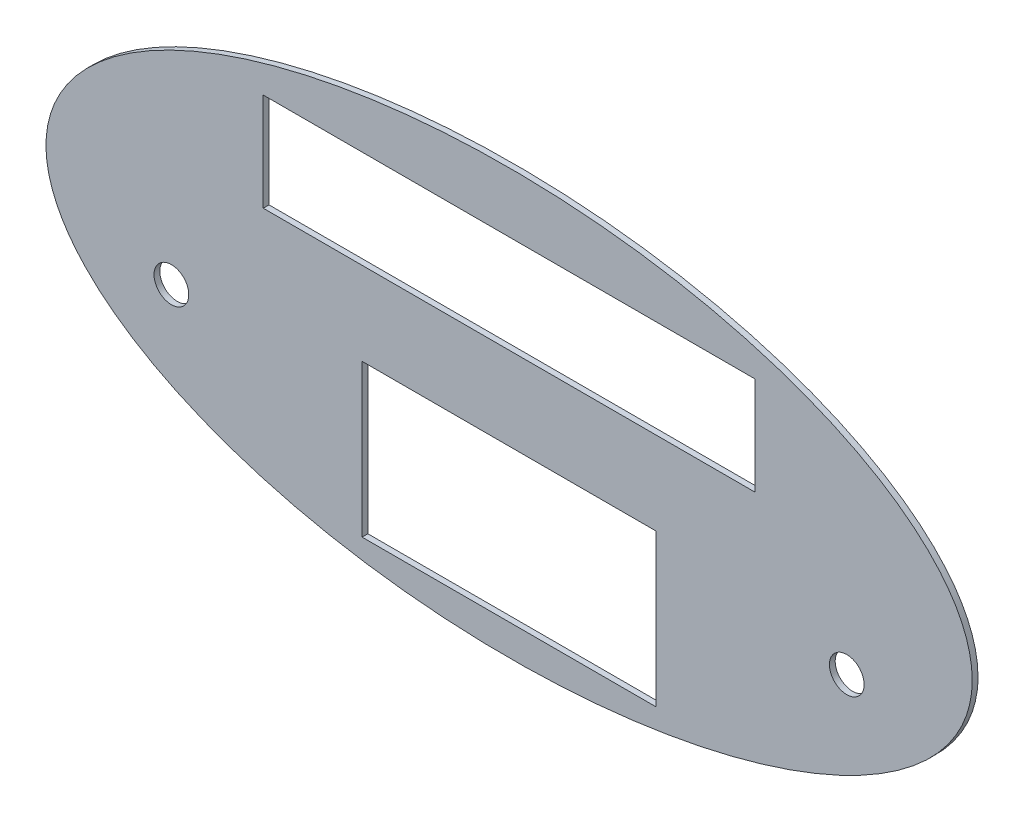
ISO-10303-21;
HEADER;
FILE_DESCRIPTION(('STEP AP214'),'2;1');
FILE_NAME('part.step','',(''),(''),'','','');
FILE_SCHEMA(('AUTOMOTIVE_DESIGN { 1 0 10303 214 1 1 1 1 }'));
ENDSEC;
DATA;
#1=APPLICATION_CONTEXT('core data for automotive mechanical design processes');
#2=APPLICATION_PROTOCOL_DEFINITION('international standard','automotive_design',2000,#1);
#3=PRODUCT_CONTEXT('',#1,'mechanical');
#4=PRODUCT('Part','Part','',(#3));
#5=PRODUCT_RELATED_PRODUCT_CATEGORY('part','',(#4));
#6=PRODUCT_DEFINITION_FORMATION('','',#4);
#7=PRODUCT_DEFINITION_CONTEXT('part definition',#1,'design');
#8=PRODUCT_DEFINITION('design','',#6,#7);
#9=PRODUCT_DEFINITION_SHAPE('','',#8);
#10=(LENGTH_UNIT() NAMED_UNIT(*) SI_UNIT(.MILLI.,.METRE.));
#11=(NAMED_UNIT(*) PLANE_ANGLE_UNIT() SI_UNIT($,.RADIAN.));
#12=(NAMED_UNIT(*) SI_UNIT($,.STERADIAN.) SOLID_ANGLE_UNIT());
#13=UNCERTAINTY_MEASURE_WITH_UNIT(LENGTH_MEASURE(1.E-05),#10,'distance_accuracy_value','');
#14=(GEOMETRIC_REPRESENTATION_CONTEXT(3) GLOBAL_UNCERTAINTY_ASSIGNED_CONTEXT((#13)) GLOBAL_UNIT_ASSIGNED_CONTEXT((#10,
#11,#12)) REPRESENTATION_CONTEXT('',''));
#15=CARTESIAN_POINT('',(0.,0.,0.));
#16=DIRECTION('',(0.,0.,1.));
#17=DIRECTION('',(1.,0.,0.));
#18=AXIS2_PLACEMENT_3D('',#15,#16,#17);
#19=CARTESIAN_POINT('',(0.,0.,-3.));
#20=DIRECTION('',(0.,0.,1.));
#21=DIRECTION('',(1.,0.,0.));
#22=AXIS2_PLACEMENT_3D('',#19,#20,#21);
#23=ELLIPSE('',#22,240.,110.);
#24=DIRECTION('',(0.,0.,1.));
#25=VECTOR('',#24,1.);
#26=SURFACE_OF_LINEAR_EXTRUSION('',#23,#25);
#27=CARTESIAN_POINT('',(240.,0.,-3.));
#28=VERTEX_POINT('',#27);
#29=EDGE_CURVE('E11',#28,#28,#23,.T.);
#30=ORIENTED_EDGE('',*,*,#29,.T.);
#31=EDGE_LOOP('',(#30));
#32=FACE_BOUND('',#31,.T.);
#33=CARTESIAN_POINT('',(0.,0.,0.));
#34=DIRECTION('',(0.,0.,1.));
#35=DIRECTION('',(1.,0.,0.));
#36=AXIS2_PLACEMENT_3D('',#33,#34,#35);
#37=ELLIPSE('',#36,240.,110.);
#38=CARTESIAN_POINT('',(240.,0.,0.));
#39=VERTEX_POINT('',#38);
#40=EDGE_CURVE('E39',#39,#39,#37,.T.);
#41=ORIENTED_EDGE('',*,*,#40,.F.);
#42=EDGE_LOOP('',(#41));
#43=FACE_BOUND('',#42,.T.);
#44=ADVANCED_FACE('F35',(#32,#43),#26,.T.);
#45=CARTESIAN_POINT('',(0.,0.,-3.));
#46=DIRECTION('',(0.,0.,1.));
#47=DIRECTION('',(1.,0.,0.));
#48=AXIS2_PLACEMENT_3D('',#45,#46,#47);
#49=PLANE('',#48);
#50=CARTESIAN_POINT('',(175.,-30.,-3.));
#51=DIRECTION('',(0.,0.,1.));
#52=DIRECTION('',(1.,0.,0.));
#53=AXIS2_PLACEMENT_3D('',#50,#51,#52);
#54=CIRCLE('',#53,9.00000000000001);
#55=CARTESIAN_POINT('',(184.,-30.,-3.));
#56=VERTEX_POINT('',#55);
#57=EDGE_CURVE('E130',#56,#56,#54,.T.);
#58=ORIENTED_EDGE('',*,*,#57,.T.);
#59=EDGE_LOOP('',(#58));
#60=FACE_BOUND('',#59,.T.);
#61=CARTESIAN_POINT('',(-175.,-30.,-3.));
#62=DIRECTION('',(0.,0.,1.));
#63=DIRECTION('',(-1.,0.,0.));
#64=AXIS2_PLACEMENT_3D('',#61,#62,#63);
#65=CIRCLE('',#64,9.00000000000001);
#66=CARTESIAN_POINT('',(-184.,-30.,-3.));
#67=VERTEX_POINT('',#66);
#68=EDGE_CURVE('E248',#67,#67,#65,.T.);
#69=ORIENTED_EDGE('',*,*,#68,.T.);
#70=EDGE_LOOP('',(#69));
#71=FACE_BOUND('',#70,.T.);
#72=DIRECTION('',(-1.,0.,0.));
#73=VECTOR('',#72,1.);
#74=CARTESIAN_POINT('',(-76.2,-15.,-3.));
#75=LINE('',#74,#73);
#76=CARTESIAN_POINT('',(76.2,-15.,-3.));
#77=VERTEX_POINT('',#76);
#78=CARTESIAN_POINT('',(-76.2,-15.,-3.));
#79=VERTEX_POINT('',#78);
#80=EDGE_CURVE('E107',#77,#79,#75,.T.);
#81=ORIENTED_EDGE('',*,*,#80,.T.);
#82=DIRECTION('',(0.,-1.,0.));
#83=VECTOR('',#82,1.);
#84=CARTESIAN_POINT('',(-76.2,-15.,-3.));
#85=LINE('',#84,#83);
#86=CARTESIAN_POINT('',(-76.2,-93.9,-3.));
#87=VERTEX_POINT('',#86);
#88=EDGE_CURVE('E101',#79,#87,#85,.T.);
#89=ORIENTED_EDGE('',*,*,#88,.T.);
#90=DIRECTION('',(1.,0.,0.));
#91=VECTOR('',#90,1.);
#92=CARTESIAN_POINT('',(-76.2,-93.9,-3.));
#93=LINE('',#92,#91);
#94=CARTESIAN_POINT('',(76.2,-93.9,-3.));
#95=VERTEX_POINT('',#94);
#96=EDGE_CURVE('E110',#87,#95,#93,.T.);
#97=ORIENTED_EDGE('',*,*,#96,.T.);
#98=DIRECTION('',(0.,1.,0.));
#99=VECTOR('',#98,1.);
#100=CARTESIAN_POINT('',(76.2,-15.,-3.));
#101=LINE('',#100,#99);
#102=EDGE_CURVE('E49',#95,#77,#101,.T.);
#103=ORIENTED_EDGE('',*,*,#102,.T.);
#104=EDGE_LOOP('',(#81,#89,#97,#103));
#105=FACE_BOUND('',#104,.T.);
#106=DIRECTION('',(-1.,0.,0.));
#107=VECTOR('',#106,1.);
#108=CARTESIAN_POINT('',(-127.4,78.9000000000001,-3.));
#109=LINE('',#108,#107);
#110=CARTESIAN_POINT('',(127.4,78.9,-3.));
#111=VERTEX_POINT('',#110);
#112=CARTESIAN_POINT('',(-127.4,78.9000000000001,-3.));
#113=VERTEX_POINT('',#112);
#114=EDGE_CURVE('E150',#111,#113,#109,.T.);
#115=ORIENTED_EDGE('',*,*,#114,.T.);
#116=DIRECTION('',(0.,-1.,0.));
#117=VECTOR('',#116,1.);
#118=CARTESIAN_POINT('',(-127.4,78.9000000000001,-3.));
#119=LINE('',#118,#117);
#120=CARTESIAN_POINT('',(-127.4,28.1,-3.));
#121=VERTEX_POINT('',#120);
#122=EDGE_CURVE('E140',#113,#121,#119,.T.);
#123=ORIENTED_EDGE('',*,*,#122,.T.);
#124=DIRECTION('',(1.,0.,0.));
#125=VECTOR('',#124,1.);
#126=CARTESIAN_POINT('',(-127.4,28.1,-3.));
#127=LINE('',#126,#125);
#128=CARTESIAN_POINT('',(127.4,28.1,-3.));
#129=VERTEX_POINT('',#128);
#130=EDGE_CURVE('E143',#121,#129,#127,.T.);
#131=ORIENTED_EDGE('',*,*,#130,.T.);
#132=DIRECTION('',(0.,1.,0.));
#133=VECTOR('',#132,1.);
#134=CARTESIAN_POINT('',(127.4,78.9,-3.));
#135=LINE('',#134,#133);
#136=EDGE_CURVE('E147',#129,#111,#135,.T.);
#137=ORIENTED_EDGE('',*,*,#136,.T.);
#138=EDGE_LOOP('',(#115,#123,#131,#137));
#139=FACE_BOUND('',#138,.T.);
#140=ORIENTED_EDGE('',*,*,#29,.F.);
#141=EDGE_LOOP('',(#140));
#142=FACE_BOUND('',#141,.T.);
#143=ADVANCED_FACE('F114',(#60,#71,#105,#139,#142),#49,.F.);
#144=CARTESIAN_POINT('',(0.,0.,0.));
#145=DIRECTION('',(0.,0.,1.));
#146=DIRECTION('',(1.,0.,0.));
#147=AXIS2_PLACEMENT_3D('',#144,#145,#146);
#148=PLANE('',#147);
#149=CARTESIAN_POINT('',(175.,-30.,0.));
#150=DIRECTION('',(0.,0.,1.));
#151=DIRECTION('',(1.,0.,0.));
#152=AXIS2_PLACEMENT_3D('',#149,#150,#151);
#153=CIRCLE('',#152,9.00000000000001);
#154=CARTESIAN_POINT('',(184.,-30.,0.));
#155=VERTEX_POINT('',#154);
#156=EDGE_CURVE('E247',#155,#155,#153,.T.);
#157=ORIENTED_EDGE('',*,*,#156,.F.);
#158=EDGE_LOOP('',(#157));
#159=FACE_BOUND('',#158,.T.);
#160=CARTESIAN_POINT('',(-175.,-30.,0.));
#161=DIRECTION('',(0.,0.,1.));
#162=DIRECTION('',(-1.,0.,0.));
#163=AXIS2_PLACEMENT_3D('',#160,#161,#162);
#164=CIRCLE('',#163,9.00000000000001);
#165=CARTESIAN_POINT('',(-184.,-30.,0.));
#166=VERTEX_POINT('',#165);
#167=EDGE_CURVE('E123',#166,#166,#164,.T.);
#168=ORIENTED_EDGE('',*,*,#167,.F.);
#169=EDGE_LOOP('',(#168));
#170=FACE_BOUND('',#169,.T.);
#171=DIRECTION('',(0.,-1.,0.));
#172=VECTOR('',#171,1.);
#173=CARTESIAN_POINT('',(-76.2,-15.,0.));
#174=LINE('',#173,#172);
#175=CARTESIAN_POINT('',(-76.2,-15.,0.));
#176=VERTEX_POINT('',#175);
#177=CARTESIAN_POINT('',(-76.2,-93.9,0.));
#178=VERTEX_POINT('',#177);
#179=EDGE_CURVE('E57',#176,#178,#174,.T.);
#180=ORIENTED_EDGE('',*,*,#179,.F.);
#181=DIRECTION('',(-1.,0.,0.));
#182=VECTOR('',#181,1.);
#183=CARTESIAN_POINT('',(-76.2,-15.,0.));
#184=LINE('',#183,#182);
#185=CARTESIAN_POINT('',(76.2,-15.,0.));
#186=VERTEX_POINT('',#185);
#187=EDGE_CURVE('E117',#186,#176,#184,.T.);
#188=ORIENTED_EDGE('',*,*,#187,.F.);
#189=DIRECTION('',(0.,1.,0.));
#190=VECTOR('',#189,1.);
#191=CARTESIAN_POINT('',(76.2,-15.,0.));
#192=LINE('',#191,#190);
#193=CARTESIAN_POINT('',(76.2,-93.9,0.));
#194=VERTEX_POINT('',#193);
#195=EDGE_CURVE('E120',#194,#186,#192,.T.);
#196=ORIENTED_EDGE('',*,*,#195,.F.);
#197=DIRECTION('',(1.,0.,0.));
#198=VECTOR('',#197,1.);
#199=CARTESIAN_POINT('',(-76.2,-93.9,0.));
#200=LINE('',#199,#198);
#201=EDGE_CURVE('E129',#178,#194,#200,.T.);
#202=ORIENTED_EDGE('',*,*,#201,.F.);
#203=EDGE_LOOP('',(#180,#188,#196,#202));
#204=FACE_BOUND('',#203,.T.);
#205=DIRECTION('',(0.,-1.,0.));
#206=VECTOR('',#205,1.);
#207=CARTESIAN_POINT('',(-127.4,78.9000000000001,0.));
#208=LINE('',#207,#206);
#209=CARTESIAN_POINT('',(-127.4,78.9000000000001,0.));
#210=VERTEX_POINT('',#209);
#211=CARTESIAN_POINT('',(-127.4,28.1,0.));
#212=VERTEX_POINT('',#211);
#213=EDGE_CURVE('E136',#210,#212,#208,.T.);
#214=ORIENTED_EDGE('',*,*,#213,.F.);
#215=DIRECTION('',(-1.,0.,0.));
#216=VECTOR('',#215,1.);
#217=CARTESIAN_POINT('',(-127.4,78.9000000000001,0.));
#218=LINE('',#217,#216);
#219=CARTESIAN_POINT('',(127.4,78.9,0.));
#220=VERTEX_POINT('',#219);
#221=EDGE_CURVE('E144',#220,#210,#218,.T.);
#222=ORIENTED_EDGE('',*,*,#221,.F.);
#223=DIRECTION('',(0.,1.,0.));
#224=VECTOR('',#223,1.);
#225=CARTESIAN_POINT('',(127.4,78.9,0.));
#226=LINE('',#225,#224);
#227=CARTESIAN_POINT('',(127.4,28.1,0.));
#228=VERTEX_POINT('',#227);
#229=EDGE_CURVE('E158',#228,#220,#226,.T.);
#230=ORIENTED_EDGE('',*,*,#229,.F.);
#231=DIRECTION('',(1.,0.,0.));
#232=VECTOR('',#231,1.);
#233=CARTESIAN_POINT('',(-127.4,28.1,0.));
#234=LINE('',#233,#232);
#235=EDGE_CURVE('E155',#212,#228,#234,.T.);
#236=ORIENTED_EDGE('',*,*,#235,.F.);
#237=EDGE_LOOP('',(#214,#222,#230,#236));
#238=FACE_BOUND('',#237,.T.);
#239=ORIENTED_EDGE('',*,*,#40,.T.);
#240=EDGE_LOOP('',(#239));
#241=FACE_BOUND('',#240,.T.);
#242=ADVANCED_FACE('F181',(#159,#170,#204,#238,#241),#148,.T.);
#243=CARTESIAN_POINT('',(-127.4,78.9000000000001,-3.));
#244=DIRECTION('',(-1.,0.,0.));
#245=DIRECTION('',(0.,0.,1.));
#246=AXIS2_PLACEMENT_3D('',#243,#244,#245);
#247=PLANE('',#246);
#248=ORIENTED_EDGE('',*,*,#213,.T.);
#249=DIRECTION('',(0.,0.,1.));
#250=VECTOR('',#249,1.);
#251=CARTESIAN_POINT('',(-127.4,28.1,-3.));
#252=LINE('',#251,#250);
#253=EDGE_CURVE('E153',#121,#212,#252,.T.);
#254=ORIENTED_EDGE('',*,*,#253,.F.);
#255=ORIENTED_EDGE('',*,*,#122,.F.);
#256=DIRECTION('',(0.,0.,1.));
#257=VECTOR('',#256,1.);
#258=CARTESIAN_POINT('',(-127.4,78.9000000000001,-3.));
#259=LINE('',#258,#257);
#260=EDGE_CURVE('E163',#113,#210,#259,.T.);
#261=ORIENTED_EDGE('',*,*,#260,.T.);
#262=EDGE_LOOP('',(#248,#254,#255,#261));
#263=FACE_BOUND('',#262,.T.);
#264=ADVANCED_FACE('F188',(#263),#247,.F.);
#265=CARTESIAN_POINT('',(-127.4,78.9000000000001,-3.));
#266=DIRECTION('',(0.,1.,0.));
#267=DIRECTION('',(-1.,0.,0.));
#268=AXIS2_PLACEMENT_3D('',#265,#266,#267);
#269=PLANE('',#268);
#270=ORIENTED_EDGE('',*,*,#221,.T.);
#271=ORIENTED_EDGE('',*,*,#260,.F.);
#272=ORIENTED_EDGE('',*,*,#114,.F.);
#273=DIRECTION('',(0.,0.,1.));
#274=VECTOR('',#273,1.);
#275=CARTESIAN_POINT('',(127.4,78.9,-3.));
#276=LINE('',#275,#274);
#277=EDGE_CURVE('E165',#111,#220,#276,.T.);
#278=ORIENTED_EDGE('',*,*,#277,.T.);
#279=EDGE_LOOP('',(#270,#271,#272,#278));
#280=FACE_BOUND('',#279,.T.);
#281=ADVANCED_FACE('F190',(#280),#269,.F.);
#282=CARTESIAN_POINT('',(127.4,78.9,-3.));
#283=DIRECTION('',(1.,0.,0.));
#284=DIRECTION('',(0.,0.,-1.));
#285=AXIS2_PLACEMENT_3D('',#282,#283,#284);
#286=PLANE('',#285);
#287=ORIENTED_EDGE('',*,*,#229,.T.);
#288=ORIENTED_EDGE('',*,*,#277,.F.);
#289=ORIENTED_EDGE('',*,*,#136,.F.);
#290=DIRECTION('',(0.,0.,1.));
#291=VECTOR('',#290,1.);
#292=CARTESIAN_POINT('',(127.4,28.1,-3.));
#293=LINE('',#292,#291);
#294=EDGE_CURVE('E167',#129,#228,#293,.T.);
#295=ORIENTED_EDGE('',*,*,#294,.T.);
#296=EDGE_LOOP('',(#287,#288,#289,#295));
#297=FACE_BOUND('',#296,.T.);
#298=ADVANCED_FACE('F185',(#297),#286,.F.);
#299=CARTESIAN_POINT('',(-127.4,28.1,-3.));
#300=DIRECTION('',(0.,-1.,0.));
#301=DIRECTION('',(1.,0.,0.));
#302=AXIS2_PLACEMENT_3D('',#299,#300,#301);
#303=PLANE('',#302);
#304=ORIENTED_EDGE('',*,*,#235,.T.);
#305=ORIENTED_EDGE('',*,*,#294,.F.);
#306=ORIENTED_EDGE('',*,*,#130,.F.);
#307=ORIENTED_EDGE('',*,*,#253,.T.);
#308=EDGE_LOOP('',(#304,#305,#306,#307));
#309=FACE_BOUND('',#308,.T.);
#310=ADVANCED_FACE('F174',(#309),#303,.F.);
#311=CARTESIAN_POINT('',(-76.2,-15.,-3.));
#312=DIRECTION('',(-1.,0.,0.));
#313=DIRECTION('',(0.,-1.,0.));
#314=AXIS2_PLACEMENT_3D('',#311,#312,#313);
#315=PLANE('',#314);
#316=ORIENTED_EDGE('',*,*,#179,.T.);
#317=DIRECTION('',(0.,0.,1.));
#318=VECTOR('',#317,1.);
#319=CARTESIAN_POINT('',(-76.2,-93.9,-3.));
#320=LINE('',#319,#318);
#321=EDGE_CURVE('E97',#87,#178,#320,.T.);
#322=ORIENTED_EDGE('',*,*,#321,.F.);
#323=ORIENTED_EDGE('',*,*,#88,.F.);
#324=DIRECTION('',(0.,0.,1.));
#325=VECTOR('',#324,1.);
#326=CARTESIAN_POINT('',(-76.2,-15.,-3.));
#327=LINE('',#326,#325);
#328=EDGE_CURVE('E134',#79,#176,#327,.T.);
#329=ORIENTED_EDGE('',*,*,#328,.T.);
#330=EDGE_LOOP('',(#316,#322,#323,#329));
#331=FACE_BOUND('',#330,.T.);
#332=ADVANCED_FACE('F99',(#331),#315,.F.);
#333=CARTESIAN_POINT('',(-76.2,-15.,-3.));
#334=DIRECTION('',(0.,1.,0.));
#335=DIRECTION('',(0.,0.,1.));
#336=AXIS2_PLACEMENT_3D('',#333,#334,#335);
#337=PLANE('',#336);
#338=ORIENTED_EDGE('',*,*,#187,.T.);
#339=ORIENTED_EDGE('',*,*,#328,.F.);
#340=ORIENTED_EDGE('',*,*,#80,.F.);
#341=DIRECTION('',(0.,0.,1.));
#342=VECTOR('',#341,1.);
#343=CARTESIAN_POINT('',(76.2,-15.,-3.));
#344=LINE('',#343,#342);
#345=EDGE_CURVE('E137',#77,#186,#344,.T.);
#346=ORIENTED_EDGE('',*,*,#345,.T.);
#347=EDGE_LOOP('',(#338,#339,#340,#346));
#348=FACE_BOUND('',#347,.T.);
#349=ADVANCED_FACE('F222',(#348),#337,.F.);
#350=CARTESIAN_POINT('',(76.2,-15.,-3.));
#351=DIRECTION('',(1.,0.,0.));
#352=DIRECTION('',(0.,1.,0.));
#353=AXIS2_PLACEMENT_3D('',#350,#351,#352);
#354=PLANE('',#353);
#355=ORIENTED_EDGE('',*,*,#195,.T.);
#356=ORIENTED_EDGE('',*,*,#345,.F.);
#357=ORIENTED_EDGE('',*,*,#102,.F.);
#358=DIRECTION('',(0.,0.,1.));
#359=VECTOR('',#358,1.);
#360=CARTESIAN_POINT('',(76.2,-93.9,-3.));
#361=LINE('',#360,#359);
#362=EDGE_CURVE('E106',#95,#194,#361,.T.);
#363=ORIENTED_EDGE('',*,*,#362,.T.);
#364=EDGE_LOOP('',(#355,#356,#357,#363));
#365=FACE_BOUND('',#364,.T.);
#366=ADVANCED_FACE('F226',(#365),#354,.F.);
#367=CARTESIAN_POINT('',(-76.2,-93.9,-3.));
#368=DIRECTION('',(0.,-1.,0.));
#369=DIRECTION('',(0.,0.,-1.));
#370=AXIS2_PLACEMENT_3D('',#367,#368,#369);
#371=PLANE('',#370);
#372=ORIENTED_EDGE('',*,*,#201,.T.);
#373=ORIENTED_EDGE('',*,*,#362,.F.);
#374=ORIENTED_EDGE('',*,*,#96,.F.);
#375=ORIENTED_EDGE('',*,*,#321,.T.);
#376=EDGE_LOOP('',(#372,#373,#374,#375));
#377=FACE_BOUND('',#376,.T.);
#378=ADVANCED_FACE('F111',(#377),#371,.F.);
#379=CARTESIAN_POINT('',(-175.,-30.,-3.));
#380=DIRECTION('',(0.,0.,1.));
#381=DIRECTION('',(1.,0.,0.));
#382=AXIS2_PLACEMENT_3D('',#379,#380,#381);
#383=CYLINDRICAL_SURFACE('',#382,9.00000000000001);
#384=ORIENTED_EDGE('',*,*,#68,.F.);
#385=EDGE_LOOP('',(#384));
#386=FACE_BOUND('',#385,.T.);
#387=ORIENTED_EDGE('',*,*,#167,.T.);
#388=EDGE_LOOP('',(#387));
#389=FACE_BOUND('',#388,.T.);
#390=ADVANCED_FACE('F232',(#386,#389),#383,.F.);
#391=CARTESIAN_POINT('',(175.,-30.,-3.));
#392=DIRECTION('',(0.,0.,1.));
#393=DIRECTION('',(1.,0.,0.));
#394=AXIS2_PLACEMENT_3D('',#391,#392,#393);
#395=CYLINDRICAL_SURFACE('',#394,9.00000000000001);
#396=ORIENTED_EDGE('',*,*,#57,.F.);
#397=EDGE_LOOP('',(#396));
#398=FACE_BOUND('',#397,.T.);
#399=ORIENTED_EDGE('',*,*,#156,.T.);
#400=EDGE_LOOP('',(#399));
#401=FACE_BOUND('',#400,.T.);
#402=ADVANCED_FACE('F237',(#398,#401),#395,.F.);
#403=CLOSED_SHELL('',(#44,#143,#242,#264,#281,#298,#310,#332,#349,#366,#378,#390,#402));
#404=MANIFOLD_SOLID_BREP('B2',#403);
#405=ADVANCED_BREP_SHAPE_REPRESENTATION('',(#18,#404),#14);
#406=SHAPE_DEFINITION_REPRESENTATION(#9,#405);
ENDSEC;
END-ISO-10303-21;
